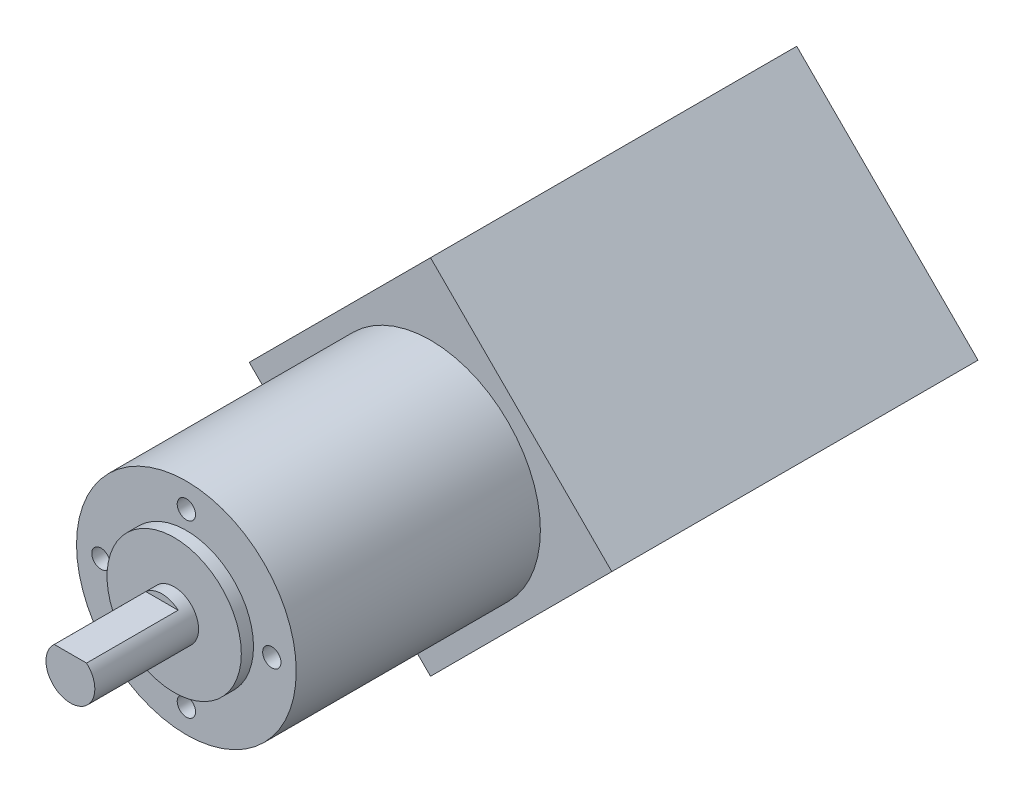
ISO-10303-21;
HEADER;
FILE_DESCRIPTION(('STEP AP214'),'2;1');
FILE_NAME('part.step','',(''),(''),'','','');
FILE_SCHEMA(('AUTOMOTIVE_DESIGN { 1 0 10303 214 1 1 1 1 }'));
ENDSEC;
DATA;
#1=APPLICATION_CONTEXT('core data for automotive mechanical design processes');
#2=APPLICATION_PROTOCOL_DEFINITION('international standard','automotive_design',2000,#1);
#3=PRODUCT_CONTEXT('',#1,'mechanical');
#4=PRODUCT('Part','Part','',(#3));
#5=PRODUCT_RELATED_PRODUCT_CATEGORY('part','',(#4));
#6=PRODUCT_DEFINITION_FORMATION('','',#4);
#7=PRODUCT_DEFINITION_CONTEXT('part definition',#1,'design');
#8=PRODUCT_DEFINITION('design','',#6,#7);
#9=PRODUCT_DEFINITION_SHAPE('','',#8);
#10=(LENGTH_UNIT() NAMED_UNIT(*) SI_UNIT(.MILLI.,.METRE.));
#11=(NAMED_UNIT(*) PLANE_ANGLE_UNIT() SI_UNIT($,.RADIAN.));
#12=(NAMED_UNIT(*) SI_UNIT($,.STERADIAN.) SOLID_ANGLE_UNIT());
#13=UNCERTAINTY_MEASURE_WITH_UNIT(LENGTH_MEASURE(1.E-05),#10,'distance_accuracy_value','');
#14=(GEOMETRIC_REPRESENTATION_CONTEXT(3) GLOBAL_UNCERTAINTY_ASSIGNED_CONTEXT((#13)) GLOBAL_UNIT_ASSIGNED_CONTEXT((#10,
#11,#12)) REPRESENTATION_CONTEXT('',''));
#15=CARTESIAN_POINT('',(0.,0.,0.));
#16=DIRECTION('',(0.,0.,1.));
#17=DIRECTION('',(1.,0.,0.));
#18=AXIS2_PLACEMENT_3D('',#15,#16,#17);
#19=CARTESIAN_POINT('',(0.,29.698484809835,60.));
#20=DIRECTION('',(-0.707106781186546,-0.707106781186549,0.));
#21=DIRECTION('',(0.707106781186549,-0.707106781186546,0.));
#22=AXIS2_PLACEMENT_3D('',#19,#20,#21);
#23=PLANE('',#22);
#24=DIRECTION('',(-0.707106781186549,0.707106781186546,0.));
#25=VECTOR('',#24,1.);
#26=CARTESIAN_POINT('',(0.,29.698484809835,0.));
#27=LINE('',#26,#25);
#28=CARTESIAN_POINT('',(29.698484809835,0.,0.));
#29=VERTEX_POINT('',#28);
#30=CARTESIAN_POINT('',(0.,29.698484809835,0.));
#31=VERTEX_POINT('',#30);
#32=EDGE_CURVE('E154',#29,#31,#27,.T.);
#33=ORIENTED_EDGE('',*,*,#32,.T.);
#34=DIRECTION('',(0.,0.,-1.));
#35=VECTOR('',#34,1.);
#36=CARTESIAN_POINT('',(0.,29.698484809835,60.));
#37=LINE('',#36,#35);
#38=CARTESIAN_POINT('',(0.,29.698484809835,60.));
#39=VERTEX_POINT('',#38);
#40=EDGE_CURVE('E39',#39,#31,#37,.T.);
#41=ORIENTED_EDGE('',*,*,#40,.F.);
#42=DIRECTION('',(-0.707106781186549,0.707106781186546,0.));
#43=VECTOR('',#42,1.);
#44=CARTESIAN_POINT('',(0.,29.698484809835,60.));
#45=LINE('',#44,#43);
#46=CARTESIAN_POINT('',(29.698484809835,0.,60.));
#47=VERTEX_POINT('',#46);
#48=EDGE_CURVE('E157',#47,#39,#45,.T.);
#49=ORIENTED_EDGE('',*,*,#48,.F.);
#50=DIRECTION('',(0.,0.,-1.));
#51=VECTOR('',#50,1.);
#52=CARTESIAN_POINT('',(29.698484809835,0.,60.));
#53=LINE('',#52,#51);
#54=EDGE_CURVE('E163',#47,#29,#53,.T.);
#55=ORIENTED_EDGE('',*,*,#54,.T.);
#56=EDGE_LOOP('',(#33,#41,#49,#55));
#57=FACE_BOUND('',#56,.T.);
#58=ADVANCED_FACE('F36',(#57),#23,.F.);
#59=CARTESIAN_POINT('',(-29.698484809835,0.,60.));
#60=DIRECTION('',(0.707106781186549,-0.707106781186546,0.));
#61=DIRECTION('',(0.707106781186546,0.707106781186549,0.));
#62=AXIS2_PLACEMENT_3D('',#59,#60,#61);
#63=PLANE('',#62);
#64=DIRECTION('',(-0.707106781186546,-0.707106781186549,0.));
#65=VECTOR('',#64,1.);
#66=CARTESIAN_POINT('',(-29.698484809835,0.,0.));
#67=LINE('',#66,#65);
#68=CARTESIAN_POINT('',(-29.698484809835,0.,0.));
#69=VERTEX_POINT('',#68);
#70=EDGE_CURVE('E166',#31,#69,#67,.T.);
#71=ORIENTED_EDGE('',*,*,#70,.T.);
#72=DIRECTION('',(0.,0.,-1.));
#73=VECTOR('',#72,1.);
#74=CARTESIAN_POINT('',(-29.698484809835,0.,60.));
#75=LINE('',#74,#73);
#76=CARTESIAN_POINT('',(-29.698484809835,0.,60.));
#77=VERTEX_POINT('',#76);
#78=EDGE_CURVE('E173',#77,#69,#75,.T.);
#79=ORIENTED_EDGE('',*,*,#78,.F.);
#80=DIRECTION('',(-0.707106781186546,-0.707106781186549,0.));
#81=VECTOR('',#80,1.);
#82=CARTESIAN_POINT('',(-29.698484809835,0.,60.));
#83=LINE('',#82,#81);
#84=EDGE_CURVE('E90',#39,#77,#83,.T.);
#85=ORIENTED_EDGE('',*,*,#84,.F.);
#86=ORIENTED_EDGE('',*,*,#40,.T.);
#87=EDGE_LOOP('',(#71,#79,#85,#86));
#88=FACE_BOUND('',#87,.T.);
#89=ADVANCED_FACE('F179',(#88),#63,.F.);
#90=CARTESIAN_POINT('',(-29.698484809835,0.,60.));
#91=DIRECTION('',(0.707106781186546,0.707106781186549,0.));
#92=DIRECTION('',(-0.707106781186549,0.707106781186546,0.));
#93=AXIS2_PLACEMENT_3D('',#90,#91,#92);
#94=PLANE('',#93);
#95=DIRECTION('',(0.707106781186549,-0.707106781186546,0.));
#96=VECTOR('',#95,1.);
#97=CARTESIAN_POINT('',(-29.698484809835,0.,0.));
#98=LINE('',#97,#96);
#99=CARTESIAN_POINT('',(0.,-29.698484809835,0.));
#100=VERTEX_POINT('',#99);
#101=EDGE_CURVE('E168',#69,#100,#98,.T.);
#102=ORIENTED_EDGE('',*,*,#101,.T.);
#103=DIRECTION('',(0.,0.,-1.));
#104=VECTOR('',#103,1.);
#105=CARTESIAN_POINT('',(0.,-29.698484809835,60.));
#106=LINE('',#105,#104);
#107=CARTESIAN_POINT('',(0.,-29.698484809835,60.));
#108=VERTEX_POINT('',#107);
#109=EDGE_CURVE('E172',#108,#100,#106,.T.);
#110=ORIENTED_EDGE('',*,*,#109,.F.);
#111=DIRECTION('',(0.707106781186549,-0.707106781186546,0.));
#112=VECTOR('',#111,1.);
#113=CARTESIAN_POINT('',(-29.698484809835,0.,60.));
#114=LINE('',#113,#112);
#115=EDGE_CURVE('E160',#77,#108,#114,.T.);
#116=ORIENTED_EDGE('',*,*,#115,.F.);
#117=ORIENTED_EDGE('',*,*,#78,.T.);
#118=EDGE_LOOP('',(#102,#110,#116,#117));
#119=FACE_BOUND('',#118,.T.);
#120=ADVANCED_FACE('F186',(#119),#94,.F.);
#121=CARTESIAN_POINT('',(0.,-29.698484809835,60.));
#122=DIRECTION('',(-0.707106781186549,0.707106781186546,0.));
#123=DIRECTION('',(-0.707106781186546,-0.707106781186549,0.));
#124=AXIS2_PLACEMENT_3D('',#121,#122,#123);
#125=PLANE('',#124);
#126=DIRECTION('',(0.707106781186546,0.707106781186549,0.));
#127=VECTOR('',#126,1.);
#128=CARTESIAN_POINT('',(0.,-29.698484809835,0.));
#129=LINE('',#128,#127);
#130=EDGE_CURVE('E82',#100,#29,#129,.T.);
#131=ORIENTED_EDGE('',*,*,#130,.T.);
#132=ORIENTED_EDGE('',*,*,#54,.F.);
#133=DIRECTION('',(0.707106781186546,0.707106781186549,0.));
#134=VECTOR('',#133,1.);
#135=CARTESIAN_POINT('',(0.,-29.698484809835,60.));
#136=LINE('',#135,#134);
#137=EDGE_CURVE('E61',#108,#47,#136,.T.);
#138=ORIENTED_EDGE('',*,*,#137,.F.);
#139=ORIENTED_EDGE('',*,*,#109,.T.);
#140=EDGE_LOOP('',(#131,#132,#138,#139));
#141=FACE_BOUND('',#140,.T.);
#142=ADVANCED_FACE('F187',(#141),#125,.F.);
#143=CARTESIAN_POINT('',(0.,0.,60.));
#144=DIRECTION('',(0.,0.,1.));
#145=DIRECTION('',(1.,0.,0.));
#146=AXIS2_PLACEMENT_3D('',#143,#144,#145);
#147=PLANE('',#146);
#148=CARTESIAN_POINT('',(0.,0.,60.));
#149=DIRECTION('',(0.,0.,1.));
#150=DIRECTION('',(1.,0.,0.));
#151=AXIS2_PLACEMENT_3D('',#148,#149,#150);
#152=CIRCLE('',#151,18.);
#153=CARTESIAN_POINT('',(18.,0.,60.));
#154=VERTEX_POINT('',#153);
#155=EDGE_CURVE('E151',#154,#154,#152,.T.);
#156=ORIENTED_EDGE('',*,*,#155,.F.);
#157=EDGE_LOOP('',(#156));
#158=FACE_BOUND('',#157,.T.);
#159=ORIENTED_EDGE('',*,*,#48,.T.);
#160=ORIENTED_EDGE('',*,*,#84,.T.);
#161=ORIENTED_EDGE('',*,*,#115,.T.);
#162=ORIENTED_EDGE('',*,*,#137,.T.);
#163=EDGE_LOOP('',(#159,#160,#161,#162));
#164=FACE_BOUND('',#163,.T.);
#165=ADVANCED_FACE('F188',(#158,#164),#147,.T.);
#166=CARTESIAN_POINT('',(0.,0.,0.));
#167=DIRECTION('',(0.,0.,1.));
#168=DIRECTION('',(1.,0.,0.));
#169=AXIS2_PLACEMENT_3D('',#166,#167,#168);
#170=PLANE('',#169);
#171=ORIENTED_EDGE('',*,*,#32,.F.);
#172=ORIENTED_EDGE('',*,*,#130,.F.);
#173=ORIENTED_EDGE('',*,*,#101,.F.);
#174=ORIENTED_EDGE('',*,*,#70,.F.);
#175=EDGE_LOOP('',(#171,#172,#173,#174));
#176=FACE_BOUND('',#175,.T.);
#177=ADVANCED_FACE('F184',(#176),#170,.F.);
#178=CARTESIAN_POINT('',(0.,0.,100.));
#179=DIRECTION('',(0.,0.,-1.));
#180=DIRECTION('',(-1.,0.,0.));
#181=AXIS2_PLACEMENT_3D('',#178,#179,#180);
#182=CYLINDRICAL_SURFACE('',#181,18.);
#183=CARTESIAN_POINT('',(0.,0.,100.));
#184=DIRECTION('',(0.,0.,1.));
#185=DIRECTION('',(1.,0.,0.));
#186=AXIS2_PLACEMENT_3D('',#183,#184,#185);
#187=CIRCLE('',#186,18.);
#188=CARTESIAN_POINT('',(18.,0.,100.));
#189=VERTEX_POINT('',#188);
#190=EDGE_CURVE('E148',#189,#189,#187,.T.);
#191=ORIENTED_EDGE('',*,*,#190,.F.);
#192=EDGE_LOOP('',(#191));
#193=FACE_BOUND('',#192,.T.);
#194=ORIENTED_EDGE('',*,*,#155,.T.);
#195=EDGE_LOOP('',(#194));
#196=FACE_BOUND('',#195,.T.);
#197=ADVANCED_FACE('F196',(#193,#196),#182,.T.);
#198=CARTESIAN_POINT('',(0.,0.,100.));
#199=DIRECTION('',(0.,0.,1.));
#200=DIRECTION('',(1.,0.,0.));
#201=AXIS2_PLACEMENT_3D('',#198,#199,#200);
#202=PLANE('',#201);
#203=CARTESIAN_POINT('',(0.,14.,100.));
#204=DIRECTION('',(0.,0.,1.));
#205=DIRECTION('',(1.,0.,0.));
#206=AXIS2_PLACEMENT_3D('',#203,#204,#205);
#207=CIRCLE('',#206,1.5);
#208=CARTESIAN_POINT('',(1.5,14.,100.));
#209=VERTEX_POINT('',#208);
#210=EDGE_CURVE('E124',#209,#209,#207,.T.);
#211=ORIENTED_EDGE('',*,*,#210,.F.);
#212=EDGE_LOOP('',(#211));
#213=FACE_BOUND('',#212,.T.);
#214=CARTESIAN_POINT('',(14.0000000000004,3.95332173747447E-13,100.));
#215=DIRECTION('',(0.,0.,1.));
#216=DIRECTION('',(1.,0.,0.));
#217=AXIS2_PLACEMENT_3D('',#214,#215,#216);
#218=CIRCLE('',#217,1.50000000000031);
#219=CARTESIAN_POINT('',(15.5000000000007,3.95332173747447E-13,100.));
#220=VERTEX_POINT('',#219);
#221=EDGE_CURVE('E130',#220,#220,#218,.T.);
#222=ORIENTED_EDGE('',*,*,#221,.F.);
#223=EDGE_LOOP('',(#222));
#224=FACE_BOUND('',#223,.T.);
#225=CARTESIAN_POINT('',(7.90664347494893E-13,-14.,100.));
#226=DIRECTION('',(0.,0.,1.));
#227=DIRECTION('',(1.,0.,0.));
#228=AXIS2_PLACEMENT_3D('',#225,#226,#227);
#229=CIRCLE('',#228,1.50000000000085);
#230=CARTESIAN_POINT('',(1.50000000000164,-14.,100.));
#231=VERTEX_POINT('',#230);
#232=EDGE_CURVE('E136',#231,#231,#229,.T.);
#233=ORIENTED_EDGE('',*,*,#232,.F.);
#234=EDGE_LOOP('',(#233));
#235=FACE_BOUND('',#234,.T.);
#236=CARTESIAN_POINT('',(-13.9999999999996,-3.97046679266253E-13,100.));
#237=DIRECTION('',(0.,0.,1.));
#238=DIRECTION('',(1.,0.,0.));
#239=AXIS2_PLACEMENT_3D('',#236,#237,#238);
#240=CIRCLE('',#239,1.50000000000064);
#241=CARTESIAN_POINT('',(-12.499999999999,-3.97046679266253E-13,100.));
#242=VERTEX_POINT('',#241);
#243=EDGE_CURVE('E117',#242,#242,#240,.T.);
#244=ORIENTED_EDGE('',*,*,#243,.F.);
#245=EDGE_LOOP('',(#244));
#246=FACE_BOUND('',#245,.T.);
#247=CARTESIAN_POINT('',(0.,0.,100.));
#248=DIRECTION('',(0.,0.,1.));
#249=DIRECTION('',(1.,0.,0.));
#250=AXIS2_PLACEMENT_3D('',#247,#248,#249);
#251=CIRCLE('',#250,11.);
#252=CARTESIAN_POINT('',(11.,0.,100.));
#253=VERTEX_POINT('',#252);
#254=EDGE_CURVE('E44',#253,#253,#251,.T.);
#255=ORIENTED_EDGE('',*,*,#254,.F.);
#256=EDGE_LOOP('',(#255));
#257=FACE_BOUND('',#256,.T.);
#258=ORIENTED_EDGE('',*,*,#190,.T.);
#259=EDGE_LOOP('',(#258));
#260=FACE_BOUND('',#259,.T.);
#261=ADVANCED_FACE('F234',(#213,#224,#235,#246,#257,#260),#202,.T.);
#262=CARTESIAN_POINT('',(0.,0.,102.));
#263=DIRECTION('',(0.,0.,-1.));
#264=DIRECTION('',(-1.,0.,0.));
#265=AXIS2_PLACEMENT_3D('',#262,#263,#264);
#266=CYLINDRICAL_SURFACE('',#265,11.);
#267=CARTESIAN_POINT('',(0.,0.,102.));
#268=DIRECTION('',(0.,0.,1.));
#269=DIRECTION('',(1.,0.,0.));
#270=AXIS2_PLACEMENT_3D('',#267,#268,#269);
#271=CIRCLE('',#270,11.);
#272=CARTESIAN_POINT('',(11.,0.,102.));
#273=VERTEX_POINT('',#272);
#274=EDGE_CURVE('E144',#273,#273,#271,.T.);
#275=ORIENTED_EDGE('',*,*,#274,.F.);
#276=EDGE_LOOP('',(#275));
#277=FACE_BOUND('',#276,.T.);
#278=ORIENTED_EDGE('',*,*,#254,.T.);
#279=EDGE_LOOP('',(#278));
#280=FACE_BOUND('',#279,.T.);
#281=ADVANCED_FACE('F241',(#277,#280),#266,.T.);
#282=CARTESIAN_POINT('',(0.,0.,102.));
#283=DIRECTION('',(0.,0.,1.));
#284=DIRECTION('',(1.,0.,0.));
#285=AXIS2_PLACEMENT_3D('',#282,#283,#284);
#286=PLANE('',#285);
#287=CARTESIAN_POINT('',(0.,0.,102.));
#288=DIRECTION('',(0.,0.,1.));
#289=DIRECTION('',(1.,0.,0.));
#290=AXIS2_PLACEMENT_3D('',#287,#288,#289);
#291=CIRCLE('',#290,4.);
#292=CARTESIAN_POINT('',(4.,0.,102.));
#293=VERTEX_POINT('',#292);
#294=EDGE_CURVE('E11',#293,#293,#291,.T.);
#295=ORIENTED_EDGE('',*,*,#294,.F.);
#296=EDGE_LOOP('',(#295));
#297=FACE_BOUND('',#296,.T.);
#298=ORIENTED_EDGE('',*,*,#274,.T.);
#299=EDGE_LOOP('',(#298));
#300=FACE_BOUND('',#299,.T.);
#301=ADVANCED_FACE('F246',(#297,#300),#286,.T.);
#302=CARTESIAN_POINT('',(0.,0.,119.));
#303=DIRECTION('',(0.,0.,-1.));
#304=DIRECTION('',(-1.,0.,0.));
#305=AXIS2_PLACEMENT_3D('',#302,#303,#304);
#306=CYLINDRICAL_SURFACE('',#305,4.);
#307=CARTESIAN_POINT('',(0.,0.,119.));
#308=DIRECTION('',(0.,0.,1.));
#309=DIRECTION('',(1.,0.,0.));
#310=AXIS2_PLACEMENT_3D('',#307,#308,#309);
#311=CIRCLE('',#310,4.);
#312=CARTESIAN_POINT('',(-2.64575131106459,3.,119.));
#313=VERTEX_POINT('',#312);
#314=CARTESIAN_POINT('',(2.64575131106459,3.,119.));
#315=VERTEX_POINT('',#314);
#316=EDGE_CURVE('E115',#313,#315,#311,.T.);
#317=ORIENTED_EDGE('',*,*,#316,.F.);
#318=DIRECTION('',(0.,0.,1.));
#319=VECTOR('',#318,1.);
#320=CARTESIAN_POINT('',(-2.64575131106459,3.,104.));
#321=LINE('',#320,#319);
#322=CARTESIAN_POINT('',(-2.64575131106459,3.,104.));
#323=VERTEX_POINT('',#322);
#324=EDGE_CURVE('E52',#323,#313,#321,.T.);
#325=ORIENTED_EDGE('',*,*,#324,.F.);
#326=CARTESIAN_POINT('',(0.,0.,104.));
#327=DIRECTION('',(0.,0.,1.));
#328=DIRECTION('',(-1.,0.,0.));
#329=AXIS2_PLACEMENT_3D('',#326,#327,#328);
#330=CIRCLE('',#329,4.);
#331=CARTESIAN_POINT('',(2.64575131106459,3.,104.));
#332=VERTEX_POINT('',#331);
#333=EDGE_CURVE('E101',#332,#323,#330,.T.);
#334=ORIENTED_EDGE('',*,*,#333,.F.);
#335=DIRECTION('',(0.,0.,1.));
#336=VECTOR('',#335,1.);
#337=CARTESIAN_POINT('',(2.64575131106459,3.,104.));
#338=LINE('',#337,#336);
#339=EDGE_CURVE('E109',#332,#315,#338,.T.);
#340=ORIENTED_EDGE('',*,*,#339,.T.);
#341=EDGE_LOOP('',(#317,#325,#334,#340));
#342=FACE_BOUND('',#341,.T.);
#343=ORIENTED_EDGE('',*,*,#294,.T.);
#344=EDGE_LOOP('',(#343));
#345=FACE_BOUND('',#344,.T.);
#346=ADVANCED_FACE('F112',(#342,#345),#306,.T.);
#347=CARTESIAN_POINT('',(0.,0.,119.));
#348=DIRECTION('',(0.,0.,1.));
#349=DIRECTION('',(1.,0.,0.));
#350=AXIS2_PLACEMENT_3D('',#347,#348,#349);
#351=PLANE('',#350);
#352=DIRECTION('',(1.,0.,0.));
#353=VECTOR('',#352,1.);
#354=CARTESIAN_POINT('',(2.64575131106459,3.,119.));
#355=LINE('',#354,#353);
#356=EDGE_CURVE('E106',#313,#315,#355,.T.);
#357=ORIENTED_EDGE('',*,*,#356,.F.);
#358=ORIENTED_EDGE('',*,*,#316,.T.);
#359=EDGE_LOOP('',(#357,#358));
#360=FACE_BOUND('',#359,.T.);
#361=ADVANCED_FACE('F276',(#360),#351,.T.);
#362=CARTESIAN_POINT('',(-13.9999999999996,-3.97046679266253E-13,96.));
#363=DIRECTION('',(0.,0.,1.));
#364=DIRECTION('',(1.,0.,0.));
#365=AXIS2_PLACEMENT_3D('',#362,#363,#364);
#366=CYLINDRICAL_SURFACE('',#365,1.50000000000064);
#367=CARTESIAN_POINT('',(-13.9999999999996,-3.97046679266253E-13,96.));
#368=DIRECTION('',(0.,0.,1.));
#369=DIRECTION('',(1.,0.,0.));
#370=AXIS2_PLACEMENT_3D('',#367,#368,#369);
#371=CIRCLE('',#370,1.50000000000064);
#372=CARTESIAN_POINT('',(-12.499999999999,-3.97046679266253E-13,96.));
#373=VERTEX_POINT('',#372);
#374=EDGE_CURVE('E139',#373,#373,#371,.T.);
#375=ORIENTED_EDGE('',*,*,#374,.F.);
#376=EDGE_LOOP('',(#375));
#377=FACE_BOUND('',#376,.T.);
#378=ORIENTED_EDGE('',*,*,#243,.T.);
#379=EDGE_LOOP('',(#378));
#380=FACE_BOUND('',#379,.T.);
#381=ADVANCED_FACE('F270',(#377,#380),#366,.F.);
#382=CARTESIAN_POINT('',(-13.9999999999996,-3.97046679266253E-13,96.));
#383=DIRECTION('',(0.,0.,1.));
#384=DIRECTION('',(1.,0.,0.));
#385=AXIS2_PLACEMENT_3D('',#382,#383,#384);
#386=PLANE('',#385);
#387=ORIENTED_EDGE('',*,*,#374,.T.);
#388=EDGE_LOOP('',(#387));
#389=FACE_BOUND('',#388,.T.);
#390=ADVANCED_FACE('F275',(#389),#386,.T.);
#391=CARTESIAN_POINT('',(7.90664347494893E-13,-14.,96.));
#392=DIRECTION('',(0.,0.,1.));
#393=DIRECTION('',(1.,0.,0.));
#394=AXIS2_PLACEMENT_3D('',#391,#392,#393);
#395=CYLINDRICAL_SURFACE('',#394,1.50000000000085);
#396=CARTESIAN_POINT('',(7.90664347494893E-13,-14.,96.));
#397=DIRECTION('',(0.,0.,1.));
#398=DIRECTION('',(1.,0.,0.));
#399=AXIS2_PLACEMENT_3D('',#396,#397,#398);
#400=CIRCLE('',#399,1.50000000000085);
#401=CARTESIAN_POINT('',(1.50000000000164,-14.,96.));
#402=VERTEX_POINT('',#401);
#403=EDGE_CURVE('E133',#402,#402,#400,.T.);
#404=ORIENTED_EDGE('',*,*,#403,.F.);
#405=EDGE_LOOP('',(#404));
#406=FACE_BOUND('',#405,.T.);
#407=ORIENTED_EDGE('',*,*,#232,.T.);
#408=EDGE_LOOP('',(#407));
#409=FACE_BOUND('',#408,.T.);
#410=ADVANCED_FACE('F288',(#406,#409),#395,.F.);
#411=CARTESIAN_POINT('',(7.90664347494893E-13,-14.,96.));
#412=DIRECTION('',(0.,0.,1.));
#413=DIRECTION('',(1.,0.,0.));
#414=AXIS2_PLACEMENT_3D('',#411,#412,#413);
#415=PLANE('',#414);
#416=ORIENTED_EDGE('',*,*,#403,.T.);
#417=EDGE_LOOP('',(#416));
#418=FACE_BOUND('',#417,.T.);
#419=ADVANCED_FACE('F298',(#418),#415,.T.);
#420=CARTESIAN_POINT('',(14.0000000000004,3.95332173747447E-13,96.));
#421=DIRECTION('',(0.,0.,1.));
#422=DIRECTION('',(1.,0.,0.));
#423=AXIS2_PLACEMENT_3D('',#420,#421,#422);
#424=CYLINDRICAL_SURFACE('',#423,1.50000000000031);
#425=CARTESIAN_POINT('',(14.0000000000004,3.95332173747447E-13,96.));
#426=DIRECTION('',(0.,0.,1.));
#427=DIRECTION('',(1.,0.,0.));
#428=AXIS2_PLACEMENT_3D('',#425,#426,#427);
#429=CIRCLE('',#428,1.50000000000031);
#430=CARTESIAN_POINT('',(15.5000000000007,3.95332173747447E-13,96.));
#431=VERTEX_POINT('',#430);
#432=EDGE_CURVE('E127',#431,#431,#429,.T.);
#433=ORIENTED_EDGE('',*,*,#432,.F.);
#434=EDGE_LOOP('',(#433));
#435=FACE_BOUND('',#434,.T.);
#436=ORIENTED_EDGE('',*,*,#221,.T.);
#437=EDGE_LOOP('',(#436));
#438=FACE_BOUND('',#437,.T.);
#439=ADVANCED_FACE('F308',(#435,#438),#424,.F.);
#440=CARTESIAN_POINT('',(14.0000000000004,3.95332173747447E-13,96.));
#441=DIRECTION('',(0.,0.,1.));
#442=DIRECTION('',(1.,0.,0.));
#443=AXIS2_PLACEMENT_3D('',#440,#441,#442);
#444=PLANE('',#443);
#445=ORIENTED_EDGE('',*,*,#432,.T.);
#446=EDGE_LOOP('',(#445));
#447=FACE_BOUND('',#446,.T.);
#448=ADVANCED_FACE('F318',(#447),#444,.T.);
#449=CARTESIAN_POINT('',(0.,14.,96.));
#450=DIRECTION('',(0.,0.,1.));
#451=DIRECTION('',(1.,0.,0.));
#452=AXIS2_PLACEMENT_3D('',#449,#450,#451);
#453=CYLINDRICAL_SURFACE('',#452,1.5);
#454=CARTESIAN_POINT('',(0.,14.,96.));
#455=DIRECTION('',(0.,0.,1.));
#456=DIRECTION('',(1.,0.,0.));
#457=AXIS2_PLACEMENT_3D('',#454,#455,#456);
#458=CIRCLE('',#457,1.5);
#459=CARTESIAN_POINT('',(1.5,14.,96.));
#460=VERTEX_POINT('',#459);
#461=EDGE_CURVE('E121',#460,#460,#458,.T.);
#462=ORIENTED_EDGE('',*,*,#461,.F.);
#463=EDGE_LOOP('',(#462));
#464=FACE_BOUND('',#463,.T.);
#465=ORIENTED_EDGE('',*,*,#210,.T.);
#466=EDGE_LOOP('',(#465));
#467=FACE_BOUND('',#466,.T.);
#468=ADVANCED_FACE('F328',(#464,#467),#453,.F.);
#469=CARTESIAN_POINT('',(0.,14.,96.));
#470=DIRECTION('',(0.,0.,1.));
#471=DIRECTION('',(1.,0.,0.));
#472=AXIS2_PLACEMENT_3D('',#469,#470,#471);
#473=PLANE('',#472);
#474=ORIENTED_EDGE('',*,*,#461,.T.);
#475=EDGE_LOOP('',(#474));
#476=FACE_BOUND('',#475,.T.);
#477=ADVANCED_FACE('F338',(#476),#473,.T.);
#478=CARTESIAN_POINT('',(2.64575131106459,3.,104.));
#479=DIRECTION('',(0.,-1.,0.));
#480=DIRECTION('',(0.,0.,-1.));
#481=AXIS2_PLACEMENT_3D('',#478,#479,#480);
#482=PLANE('',#481);
#483=ORIENTED_EDGE('',*,*,#356,.T.);
#484=ORIENTED_EDGE('',*,*,#339,.F.);
#485=DIRECTION('',(1.,0.,0.));
#486=VECTOR('',#485,1.);
#487=CARTESIAN_POINT('',(2.64575131106459,3.,104.));
#488=LINE('',#487,#486);
#489=EDGE_CURVE('E103',#323,#332,#488,.T.);
#490=ORIENTED_EDGE('',*,*,#489,.F.);
#491=ORIENTED_EDGE('',*,*,#324,.T.);
#492=EDGE_LOOP('',(#483,#484,#490,#491));
#493=FACE_BOUND('',#492,.T.);
#494=ADVANCED_FACE('F108',(#493),#482,.F.);
#495=CARTESIAN_POINT('',(0.,0.,104.));
#496=DIRECTION('',(0.,0.,-1.));
#497=DIRECTION('',(-1.,0.,0.));
#498=AXIS2_PLACEMENT_3D('',#495,#496,#497);
#499=PLANE('',#498);
#500=ORIENTED_EDGE('',*,*,#333,.T.);
#501=ORIENTED_EDGE('',*,*,#489,.T.);
#502=EDGE_LOOP('',(#500,#501));
#503=FACE_BOUND('',#502,.T.);
#504=ADVANCED_FACE('F102',(#503),#499,.F.);
#505=CLOSED_SHELL('',(#58,#89,#120,#142,#165,#177,#197,#261,#281,#301,#346,#361,#381,#390,#410,
#419,#439,#448,#468,#477,#494,#504));
#506=MANIFOLD_SOLID_BREP('B2',#505);
#507=ADVANCED_BREP_SHAPE_REPRESENTATION('',(#18,#506),#14);
#508=SHAPE_DEFINITION_REPRESENTATION(#9,#507);
ENDSEC;
END-ISO-10303-21;
